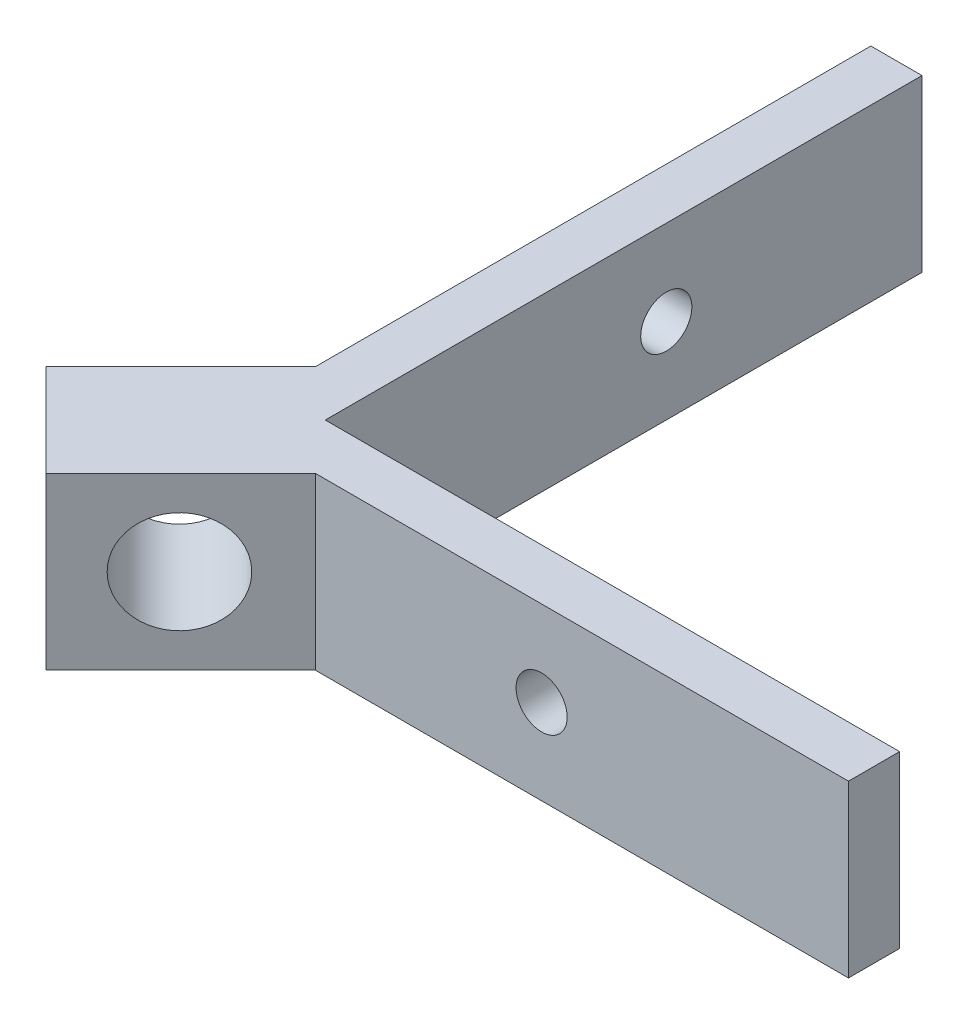
ISO-10303-21;
HEADER;
FILE_DESCRIPTION(('STEP AP214'),'2;1');
FILE_NAME('part.step','',(''),(''),'','','');
FILE_SCHEMA(('AUTOMOTIVE_DESIGN { 1 0 10303 214 1 1 1 1 }'));
ENDSEC;
DATA;
#1=APPLICATION_CONTEXT('core data for automotive mechanical design processes');
#2=APPLICATION_PROTOCOL_DEFINITION('international standard','automotive_design',2000,#1);
#3=PRODUCT_CONTEXT('',#1,'mechanical');
#4=PRODUCT('Part','Part','',(#3));
#5=PRODUCT_RELATED_PRODUCT_CATEGORY('part','',(#4));
#6=PRODUCT_DEFINITION_FORMATION('','',#4);
#7=PRODUCT_DEFINITION_CONTEXT('part definition',#1,'design');
#8=PRODUCT_DEFINITION('design','',#6,#7);
#9=PRODUCT_DEFINITION_SHAPE('','',#8);
#10=(LENGTH_UNIT() NAMED_UNIT(*) SI_UNIT(.MILLI.,.METRE.));
#11=(NAMED_UNIT(*) PLANE_ANGLE_UNIT() SI_UNIT($,.RADIAN.));
#12=(NAMED_UNIT(*) SI_UNIT($,.STERADIAN.) SOLID_ANGLE_UNIT());
#13=UNCERTAINTY_MEASURE_WITH_UNIT(LENGTH_MEASURE(1.E-05),#10,'distance_accuracy_value','');
#14=(GEOMETRIC_REPRESENTATION_CONTEXT(3) GLOBAL_UNCERTAINTY_ASSIGNED_CONTEXT((#13)) GLOBAL_UNIT_ASSIGNED_CONTEXT((#10,
#11,#12)) REPRESENTATION_CONTEXT('',''));
#15=CARTESIAN_POINT('',(0.,0.,0.));
#16=DIRECTION('',(0.,0.,1.));
#17=DIRECTION('',(1.,0.,0.));
#18=AXIS2_PLACEMENT_3D('',#15,#16,#17);
#19=CARTESIAN_POINT('',(-10.9507293811912,10.,1.12033843067425));
#20=DIRECTION('',(0.707106781186547,0.,-0.707106781186548));
#21=DIRECTION('',(-0.707106781186548,0.,-0.707106781186547));
#22=AXIS2_PLACEMENT_3D('',#19,#20,#21);
#23=PLANE('',#22);
#24=DIRECTION('',(0.707106781186548,0.,0.707106781186547));
#25=VECTOR('',#24,1.);
#26=CARTESIAN_POINT('',(-10.9507293811912,0.,1.12033843067425));
#27=LINE('',#26,#25);
#28=CARTESIAN_POINT('',(-6.58725930619123,0.,5.48380850567426));
#29=VERTEX_POINT('',#28);
#30=CARTESIAN_POINT('',(-1.17206383169652,0.,10.899003980169));
#31=VERTEX_POINT('',#30);
#32=EDGE_CURVE('E137',#29,#31,#27,.T.);
#33=ORIENTED_EDGE('',*,*,#32,.T.);
#34=DIRECTION('',(0.,1.,0.));
#35=VECTOR('',#34,1.);
#36=CARTESIAN_POINT('',(-1.17206383169651,-20.,10.899003980169));
#37=LINE('',#36,#35);
#38=CARTESIAN_POINT('',(-1.17206383169651,10.,10.899003980169));
#39=VERTEX_POINT('',#38);
#40=EDGE_CURVE('E53',#31,#39,#37,.T.);
#41=ORIENTED_EDGE('',*,*,#40,.T.);
#42=DIRECTION('',(0.707106781186548,0.,0.707106781186547));
#43=VECTOR('',#42,1.);
#44=CARTESIAN_POINT('',(-10.9507293811912,10.,1.12033843067425));
#45=LINE('',#44,#43);
#46=CARTESIAN_POINT('',(-6.58725930619123,10.,5.48380850567426));
#47=VERTEX_POINT('',#46);
#48=EDGE_CURVE('E156',#47,#39,#45,.T.);
#49=ORIENTED_EDGE('',*,*,#48,.F.);
#50=DIRECTION('',(0.,-1.,0.));
#51=VECTOR('',#50,1.);
#52=CARTESIAN_POINT('',(-6.58725930619123,10.,5.48380850567426));
#53=LINE('',#52,#51);
#54=EDGE_CURVE('E198',#47,#29,#53,.T.);
#55=ORIENTED_EDGE('',*,*,#54,.T.);
#56=EDGE_LOOP('',(#33,#41,#49,#55));
#57=FACE_BOUND('',#56,.T.);
#58=ADVANCED_FACE('F38',(#57),#23,.F.);
#59=CARTESIAN_POINT('',(6.72694014847245,10.,3.));
#60=DIRECTION('',(0.,0.,-1.));
#61=DIRECTION('',(-1.,0.,0.));
#62=AXIS2_PLACEMENT_3D('',#59,#60,#61);
#63=PLANE('',#62);
#64=CARTESIAN_POINT('',(20.,5.,3.));
#65=DIRECTION('',(0.,0.,1.));
#66=DIRECTION('',(1.,0.,0.));
#67=AXIS2_PLACEMENT_3D('',#64,#65,#66);
#68=CIRCLE('',#67,1.5);
#69=CARTESIAN_POINT('',(21.5,5.,3.));
#70=VERTEX_POINT('',#69);
#71=EDGE_CURVE('E168',#70,#70,#68,.T.);
#72=ORIENTED_EDGE('',*,*,#71,.F.);
#73=EDGE_LOOP('',(#72));
#74=FACE_BOUND('',#73,.T.);
#75=DIRECTION('',(1.,0.,0.));
#76=VECTOR('',#75,1.);
#77=CARTESIAN_POINT('',(6.72694014847245,0.,3.));
#78=LINE('',#77,#76);
#79=CARTESIAN_POINT('',(6.72694014847245,0.,3.));
#80=VERTEX_POINT('',#79);
#81=CARTESIAN_POINT('',(38.,0.,3.));
#82=VERTEX_POINT('',#81);
#83=EDGE_CURVE('E140',#80,#82,#78,.T.);
#84=ORIENTED_EDGE('',*,*,#83,.T.);
#85=DIRECTION('',(0.,-1.,0.));
#86=VECTOR('',#85,1.);
#87=CARTESIAN_POINT('',(38.,10.,3.));
#88=LINE('',#87,#86);
#89=CARTESIAN_POINT('',(38.,10.,3.));
#90=VERTEX_POINT('',#89);
#91=EDGE_CURVE('E161',#90,#82,#88,.T.);
#92=ORIENTED_EDGE('',*,*,#91,.F.);
#93=DIRECTION('',(1.,0.,0.));
#94=VECTOR('',#93,1.);
#95=CARTESIAN_POINT('',(6.72694014847245,10.,3.));
#96=LINE('',#95,#94);
#97=CARTESIAN_POINT('',(6.72694014847245,10.,3.));
#98=VERTEX_POINT('',#97);
#99=EDGE_CURVE('E98',#98,#90,#96,.T.);
#100=ORIENTED_EDGE('',*,*,#99,.F.);
#101=DIRECTION('',(0.,-1.,0.));
#102=VECTOR('',#101,1.);
#103=CARTESIAN_POINT('',(6.72694014847245,10.,3.));
#104=LINE('',#103,#102);
#105=EDGE_CURVE('E163',#98,#80,#104,.T.);
#106=ORIENTED_EDGE('',*,*,#105,.T.);
#107=EDGE_LOOP('',(#84,#92,#100,#106));
#108=FACE_BOUND('',#107,.T.);
#109=ADVANCED_FACE('F186',(#74,#108),#63,.F.);
#110=CARTESIAN_POINT('',(38.,10.,0.));
#111=DIRECTION('',(1.,0.,0.));
#112=DIRECTION('',(0.,0.,-1.));
#113=AXIS2_PLACEMENT_3D('',#110,#111,#112);
#114=PLANE('',#113);
#115=DIRECTION('',(0.,0.,1.));
#116=VECTOR('',#115,1.);
#117=CARTESIAN_POINT('',(38.,0.,0.));
#118=LINE('',#117,#116);
#119=CARTESIAN_POINT('',(38.,0.,0.));
#120=VERTEX_POINT('',#119);
#121=EDGE_CURVE('E144',#120,#82,#118,.T.);
#122=ORIENTED_EDGE('',*,*,#121,.F.);
#123=DIRECTION('',(0.,-1.,0.));
#124=VECTOR('',#123,1.);
#125=CARTESIAN_POINT('',(38.,10.,0.));
#126=LINE('',#125,#124);
#127=CARTESIAN_POINT('',(38.,10.,0.));
#128=VERTEX_POINT('',#127);
#129=EDGE_CURVE('E118',#128,#120,#126,.T.);
#130=ORIENTED_EDGE('',*,*,#129,.F.);
#131=DIRECTION('',(0.,0.,1.));
#132=VECTOR('',#131,1.);
#133=CARTESIAN_POINT('',(38.,10.,0.));
#134=LINE('',#133,#132);
#135=EDGE_CURVE('E128',#128,#90,#134,.T.);
#136=ORIENTED_EDGE('',*,*,#135,.T.);
#137=ORIENTED_EDGE('',*,*,#91,.T.);
#138=EDGE_LOOP('',(#122,#130,#136,#137));
#139=FACE_BOUND('',#138,.T.);
#140=ADVANCED_FACE('F184',(#139),#114,.T.);
#141=CARTESIAN_POINT('',(4.31174467474151,10.,0.));
#142=DIRECTION('',(0.,0.,-1.));
#143=DIRECTION('',(-1.,0.,0.));
#144=AXIS2_PLACEMENT_3D('',#141,#142,#143);
#145=PLANE('',#144);
#146=CARTESIAN_POINT('',(20.,5.,0.));
#147=DIRECTION('',(0.,0.,-1.));
#148=DIRECTION('',(-1.,0.,0.));
#149=AXIS2_PLACEMENT_3D('',#146,#147,#148);
#150=CIRCLE('',#149,1.5);
#151=CARTESIAN_POINT('',(18.5,5.,0.));
#152=VERTEX_POINT('',#151);
#153=EDGE_CURVE('E141',#152,#152,#150,.T.);
#154=ORIENTED_EDGE('',*,*,#153,.F.);
#155=EDGE_LOOP('',(#154));
#156=FACE_BOUND('',#155,.T.);
#157=DIRECTION('',(1.,0.,0.));
#158=VECTOR('',#157,1.);
#159=CARTESIAN_POINT('',(4.31174467474151,0.,0.));
#160=LINE('',#159,#158);
#161=CARTESIAN_POINT('',(4.31174467474151,0.,0.));
#162=VERTEX_POINT('',#161);
#163=EDGE_CURVE('E114',#162,#120,#160,.T.);
#164=ORIENTED_EDGE('',*,*,#163,.F.);
#165=DIRECTION('',(0.,-1.,0.));
#166=VECTOR('',#165,1.);
#167=CARTESIAN_POINT('',(4.31174467474151,10.,0.));
#168=LINE('',#167,#166);
#169=CARTESIAN_POINT('',(4.31174467474151,10.,0.));
#170=VERTEX_POINT('',#169);
#171=EDGE_CURVE('E108',#170,#162,#168,.T.);
#172=ORIENTED_EDGE('',*,*,#171,.F.);
#173=DIRECTION('',(1.,0.,0.));
#174=VECTOR('',#173,1.);
#175=CARTESIAN_POINT('',(4.31174467474151,10.,0.));
#176=LINE('',#175,#174);
#177=EDGE_CURVE('E112',#170,#128,#176,.T.);
#178=ORIENTED_EDGE('',*,*,#177,.T.);
#179=ORIENTED_EDGE('',*,*,#129,.T.);
#180=EDGE_LOOP('',(#164,#172,#178,#179));
#181=FACE_BOUND('',#180,.T.);
#182=ADVANCED_FACE('F110',(#156,#181),#145,.T.);
#183=CARTESIAN_POINT('',(4.31174467474151,10.,0.));
#184=DIRECTION('',(-1.,0.,0.));
#185=DIRECTION('',(0.,0.,1.));
#186=AXIS2_PLACEMENT_3D('',#183,#184,#185);
#187=PLANE('',#186);
#188=CARTESIAN_POINT('',(4.31174467474151,5.,-20.));
#189=DIRECTION('',(-1.,0.,0.));
#190=DIRECTION('',(0.,0.,1.));
#191=AXIS2_PLACEMENT_3D('',#188,#189,#190);
#192=CIRCLE('',#191,1.5);
#193=CARTESIAN_POINT('',(4.31174467474151,5.,-18.5));
#194=VERTEX_POINT('',#193);
#195=EDGE_CURVE('E207',#194,#194,#192,.T.);
#196=ORIENTED_EDGE('',*,*,#195,.T.);
#197=EDGE_LOOP('',(#196));
#198=FACE_BOUND('',#197,.T.);
#199=DIRECTION('',(0.,0.,-1.));
#200=VECTOR('',#199,1.);
#201=CARTESIAN_POINT('',(4.31174467474151,0.,0.));
#202=LINE('',#201,#200);
#203=CARTESIAN_POINT('',(4.31174467474151,0.,-35.));
#204=VERTEX_POINT('',#203);
#205=EDGE_CURVE('E148',#162,#204,#202,.T.);
#206=ORIENTED_EDGE('',*,*,#205,.T.);
#207=DIRECTION('',(0.,-1.,0.));
#208=VECTOR('',#207,1.);
#209=CARTESIAN_POINT('',(4.31174467474151,10.,-35.));
#210=LINE('',#209,#208);
#211=CARTESIAN_POINT('',(4.31174467474151,10.,-35.));
#212=VERTEX_POINT('',#211);
#213=EDGE_CURVE('E119',#212,#204,#210,.T.);
#214=ORIENTED_EDGE('',*,*,#213,.F.);
#215=DIRECTION('',(0.,0.,-1.));
#216=VECTOR('',#215,1.);
#217=CARTESIAN_POINT('',(4.31174467474151,10.,0.));
#218=LINE('',#217,#216);
#219=EDGE_CURVE('E122',#170,#212,#218,.T.);
#220=ORIENTED_EDGE('',*,*,#219,.F.);
#221=ORIENTED_EDGE('',*,*,#171,.T.);
#222=EDGE_LOOP('',(#206,#214,#220,#221));
#223=FACE_BOUND('',#222,.T.);
#224=ADVANCED_FACE('F123',(#198,#223),#187,.F.);
#225=CARTESIAN_POINT('',(1.31174467474151,10.,-35.));
#226=DIRECTION('',(0.,0.,-1.));
#227=DIRECTION('',(-1.,0.,0.));
#228=AXIS2_PLACEMENT_3D('',#225,#226,#227);
#229=PLANE('',#228);
#230=DIRECTION('',(1.,0.,0.));
#231=VECTOR('',#230,1.);
#232=CARTESIAN_POINT('',(1.31174467474151,0.,-35.));
#233=LINE('',#232,#231);
#234=CARTESIAN_POINT('',(1.31174467474151,0.,-35.));
#235=VERTEX_POINT('',#234);
#236=EDGE_CURVE('E150',#235,#204,#233,.T.);
#237=ORIENTED_EDGE('',*,*,#236,.F.);
#238=DIRECTION('',(0.,-1.,0.));
#239=VECTOR('',#238,1.);
#240=CARTESIAN_POINT('',(1.31174467474151,10.,-35.));
#241=LINE('',#240,#239);
#242=CARTESIAN_POINT('',(1.31174467474151,10.,-35.));
#243=VERTEX_POINT('',#242);
#244=EDGE_CURVE('E61',#243,#235,#241,.T.);
#245=ORIENTED_EDGE('',*,*,#244,.F.);
#246=DIRECTION('',(1.,0.,0.));
#247=VECTOR('',#246,1.);
#248=CARTESIAN_POINT('',(1.31174467474151,10.,-35.));
#249=LINE('',#248,#247);
#250=EDGE_CURVE('E124',#243,#212,#249,.T.);
#251=ORIENTED_EDGE('',*,*,#250,.T.);
#252=ORIENTED_EDGE('',*,*,#213,.T.);
#253=EDGE_LOOP('',(#237,#245,#251,#252));
#254=FACE_BOUND('',#253,.T.);
#255=ADVANCED_FACE('F181',(#254),#229,.T.);
#256=CARTESIAN_POINT('',(1.31174467474151,10.,-2.41519547525848));
#257=DIRECTION('',(-1.,0.,0.));
#258=DIRECTION('',(0.,0.,1.));
#259=AXIS2_PLACEMENT_3D('',#256,#257,#258);
#260=PLANE('',#259);
#261=CARTESIAN_POINT('',(1.31174467474151,5.,-20.));
#262=DIRECTION('',(-1.,0.,0.));
#263=DIRECTION('',(0.,0.,1.));
#264=AXIS2_PLACEMENT_3D('',#261,#262,#263);
#265=CIRCLE('',#264,1.5);
#266=CARTESIAN_POINT('',(1.31174467474151,5.,-18.5));
#267=VERTEX_POINT('',#266);
#268=EDGE_CURVE('E204',#267,#267,#265,.T.);
#269=ORIENTED_EDGE('',*,*,#268,.F.);
#270=EDGE_LOOP('',(#269));
#271=FACE_BOUND('',#270,.T.);
#272=DIRECTION('',(0.,0.,-1.));
#273=VECTOR('',#272,1.);
#274=CARTESIAN_POINT('',(1.31174467474151,0.,-2.41519547525848));
#275=LINE('',#274,#273);
#276=CARTESIAN_POINT('',(1.31174467474151,0.,-2.41519547525848));
#277=VERTEX_POINT('',#276);
#278=EDGE_CURVE('E153',#277,#235,#275,.T.);
#279=ORIENTED_EDGE('',*,*,#278,.F.);
#280=DIRECTION('',(0.,-1.,0.));
#281=VECTOR('',#280,1.);
#282=CARTESIAN_POINT('',(1.31174467474151,10.,-2.41519547525848));
#283=LINE('',#282,#281);
#284=CARTESIAN_POINT('',(1.31174467474151,10.,-2.41519547525848));
#285=VERTEX_POINT('',#284);
#286=EDGE_CURVE('E89',#285,#277,#283,.T.);
#287=ORIENTED_EDGE('',*,*,#286,.F.);
#288=DIRECTION('',(0.,0.,-1.));
#289=VECTOR('',#288,1.);
#290=CARTESIAN_POINT('',(1.31174467474151,10.,-2.41519547525848));
#291=LINE('',#290,#289);
#292=EDGE_CURVE('E134',#285,#243,#291,.T.);
#293=ORIENTED_EDGE('',*,*,#292,.T.);
#294=ORIENTED_EDGE('',*,*,#244,.T.);
#295=EDGE_LOOP('',(#279,#287,#293,#294));
#296=FACE_BOUND('',#295,.T.);
#297=ADVANCED_FACE('F178',(#271,#296),#260,.T.);
#298=CARTESIAN_POINT('',(0.,10.,0.));
#299=DIRECTION('',(0.,1.,0.));
#300=DIRECTION('',(0.,0.,1.));
#301=AXIS2_PLACEMENT_3D('',#298,#299,#300);
#302=PLANE('',#301);
#303=DIRECTION('',(-0.707106781186547,0.,0.707106781186548));
#304=VECTOR('',#303,1.);
#305=CARTESIAN_POINT('',(6.72694014847245,10.,3.));
#306=LINE('',#305,#304);
#307=EDGE_CURVE('E191',#98,#39,#306,.T.);
#308=ORIENTED_EDGE('',*,*,#307,.F.);
#309=ORIENTED_EDGE('',*,*,#99,.T.);
#310=ORIENTED_EDGE('',*,*,#135,.F.);
#311=ORIENTED_EDGE('',*,*,#177,.F.);
#312=ORIENTED_EDGE('',*,*,#219,.T.);
#313=ORIENTED_EDGE('',*,*,#250,.F.);
#314=ORIENTED_EDGE('',*,*,#292,.F.);
#315=DIRECTION('',(0.707106781186547,0.,-0.707106781186548));
#316=VECTOR('',#315,1.);
#317=CARTESIAN_POINT('',(1.31174467474151,10.,-2.41519547525848));
#318=LINE('',#317,#316);
#319=EDGE_CURVE('E196',#47,#285,#318,.T.);
#320=ORIENTED_EDGE('',*,*,#319,.F.);
#321=ORIENTED_EDGE('',*,*,#48,.T.);
#322=EDGE_LOOP('',(#308,#309,#310,#311,#312,#313,#314,#320,#321));
#323=FACE_BOUND('',#322,.T.);
#324=ADVANCED_FACE('F126',(#323),#302,.T.);
#325=CARTESIAN_POINT('',(0.,0.,0.));
#326=DIRECTION('',(0.,1.,0.));
#327=DIRECTION('',(0.,0.,1.));
#328=AXIS2_PLACEMENT_3D('',#325,#326,#327);
#329=PLANE('',#328);
#330=ORIENTED_EDGE('',*,*,#83,.F.);
#331=DIRECTION('',(-0.707106781186547,0.,0.707106781186548));
#332=VECTOR('',#331,1.);
#333=CARTESIAN_POINT('',(4.86347007423622,0.,4.86347007423622));
#334=LINE('',#333,#332);
#335=EDGE_CURVE('E11',#80,#31,#334,.T.);
#336=ORIENTED_EDGE('',*,*,#335,.T.);
#337=ORIENTED_EDGE('',*,*,#32,.F.);
#338=DIRECTION('',(0.707106781186547,0.,-0.707106781186548));
#339=VECTOR('',#338,1.);
#340=CARTESIAN_POINT('',(-0.551725400258487,0.,-0.551725400258487));
#341=LINE('',#340,#339);
#342=EDGE_CURVE('E46',#29,#277,#341,.T.);
#343=ORIENTED_EDGE('',*,*,#342,.T.);
#344=ORIENTED_EDGE('',*,*,#278,.T.);
#345=ORIENTED_EDGE('',*,*,#236,.T.);
#346=ORIENTED_EDGE('',*,*,#205,.F.);
#347=ORIENTED_EDGE('',*,*,#163,.T.);
#348=ORIENTED_EDGE('',*,*,#121,.T.);
#349=EDGE_LOOP('',(#330,#336,#337,#343,#344,#345,#346,#347,#348));
#350=FACE_BOUND('',#349,.T.);
#351=ADVANCED_FACE('F173',(#350),#329,.F.);
#352=CARTESIAN_POINT('',(20.,5.,-27.));
#353=DIRECTION('',(0.,0.,1.));
#354=DIRECTION('',(1.,0.,0.));
#355=AXIS2_PLACEMENT_3D('',#352,#353,#354);
#356=CYLINDRICAL_SURFACE('',#355,1.5);
#357=ORIENTED_EDGE('',*,*,#153,.T.);
#358=EDGE_LOOP('',(#357));
#359=FACE_BOUND('',#358,.T.);
#360=ORIENTED_EDGE('',*,*,#71,.T.);
#361=EDGE_LOOP('',(#360));
#362=FACE_BOUND('',#361,.T.);
#363=ADVANCED_FACE('F214',(#359,#362),#356,.F.);
#364=CARTESIAN_POINT('',(31.3117446747415,5.,-20.));
#365=DIRECTION('',(-1.,0.,0.));
#366=DIRECTION('',(0.,0.,1.));
#367=AXIS2_PLACEMENT_3D('',#364,#365,#366);
#368=CYLINDRICAL_SURFACE('',#367,1.5);
#369=ORIENTED_EDGE('',*,*,#268,.T.);
#370=EDGE_LOOP('',(#369));
#371=FACE_BOUND('',#370,.T.);
#372=ORIENTED_EDGE('',*,*,#195,.F.);
#373=EDGE_LOOP('',(#372));
#374=FACE_BOUND('',#373,.T.);
#375=ADVANCED_FACE('F241',(#371,#374),#368,.F.);
#376=CARTESIAN_POINT('',(1.31174467474151,-20.,-2.41519547525848));
#377=DIRECTION('',(0.707106781186548,0.,0.707106781186547));
#378=DIRECTION('',(0.707106781186547,0.,-0.707106781186548));
#379=AXIS2_PLACEMENT_3D('',#376,#377,#378);
#380=PLANE('',#379);
#381=CARTESIAN_POINT('',(-2.67304574381813,5.,1.56959494330116));
#382=DIRECTION('',(-0.707106781186548,0.,-0.707106781186547));
#383=DIRECTION('',(-0.707106781186547,0.,0.707106781186548));
#384=AXIS2_PLACEMENT_3D('',#381,#382,#383);
#385=CIRCLE('',#384,3.);
#386=CARTESIAN_POINT('',(-4.79436608737777,5.,3.6909152868608));
#387=VERTEX_POINT('',#386);
#388=EDGE_CURVE('E261',#387,#387,#385,.T.);
#389=ORIENTED_EDGE('',*,*,#388,.F.);
#390=EDGE_LOOP('',(#389));
#391=FACE_BOUND('',#390,.T.);
#392=ORIENTED_EDGE('',*,*,#319,.T.);
#393=ORIENTED_EDGE('',*,*,#286,.T.);
#394=ORIENTED_EDGE('',*,*,#342,.F.);
#395=ORIENTED_EDGE('',*,*,#54,.F.);
#396=EDGE_LOOP('',(#392,#393,#394,#395));
#397=FACE_BOUND('',#396,.T.);
#398=ADVANCED_FACE('F245',(#391,#397),#380,.F.);
#399=CARTESIAN_POINT('',(6.72694014847245,-20.,3.));
#400=DIRECTION('',(-0.707106781186548,0.,-0.707106781186547));
#401=DIRECTION('',(-0.707106781186547,0.,0.707106781186548));
#402=AXIS2_PLACEMENT_3D('',#399,#400,#401);
#403=PLANE('',#402);
#404=CARTESIAN_POINT('',(2.74214973067658,5.,6.98479041779586));
#405=DIRECTION('',(-0.707106781186548,0.,-0.707106781186547));
#406=DIRECTION('',(-0.707106781186547,0.,0.707106781186548));
#407=AXIS2_PLACEMENT_3D('',#404,#405,#406);
#408=CIRCLE('',#407,3.);
#409=CARTESIAN_POINT('',(0.620829387116939,5.,9.10611076135551));
#410=VERTEX_POINT('',#409);
#411=EDGE_CURVE('E41',#410,#410,#408,.T.);
#412=ORIENTED_EDGE('',*,*,#411,.T.);
#413=EDGE_LOOP('',(#412));
#414=FACE_BOUND('',#413,.T.);
#415=ORIENTED_EDGE('',*,*,#105,.F.);
#416=ORIENTED_EDGE('',*,*,#307,.T.);
#417=ORIENTED_EDGE('',*,*,#40,.F.);
#418=ORIENTED_EDGE('',*,*,#335,.F.);
#419=EDGE_LOOP('',(#415,#416,#417,#418));
#420=FACE_BOUND('',#419,.T.);
#421=ADVANCED_FACE('F189',(#414,#420),#403,.F.);
#422=CARTESIAN_POINT('',(18.5401576917783,5.,22.7827983788976));
#423=DIRECTION('',(-0.707106781186548,0.,-0.707106781186547));
#424=DIRECTION('',(-0.707106781186547,0.,0.707106781186548));
#425=AXIS2_PLACEMENT_3D('',#422,#423,#424);
#426=CYLINDRICAL_SURFACE('',#425,3.);
#427=ORIENTED_EDGE('',*,*,#388,.T.);
#428=EDGE_LOOP('',(#427));
#429=FACE_BOUND('',#428,.T.);
#430=ORIENTED_EDGE('',*,*,#411,.F.);
#431=EDGE_LOOP('',(#430));
#432=FACE_BOUND('',#431,.T.);
#433=ADVANCED_FACE('F252',(#429,#432),#426,.F.);
#434=CLOSED_SHELL('',(#58,#109,#140,#182,#224,#255,#297,#324,#351,#363,#375,#398,#421,#433));
#435=MANIFOLD_SOLID_BREP('B2',#434);
#436=ADVANCED_BREP_SHAPE_REPRESENTATION('',(#18,#435),#14);
#437=SHAPE_DEFINITION_REPRESENTATION(#9,#436);
ENDSEC;
END-ISO-10303-21;
